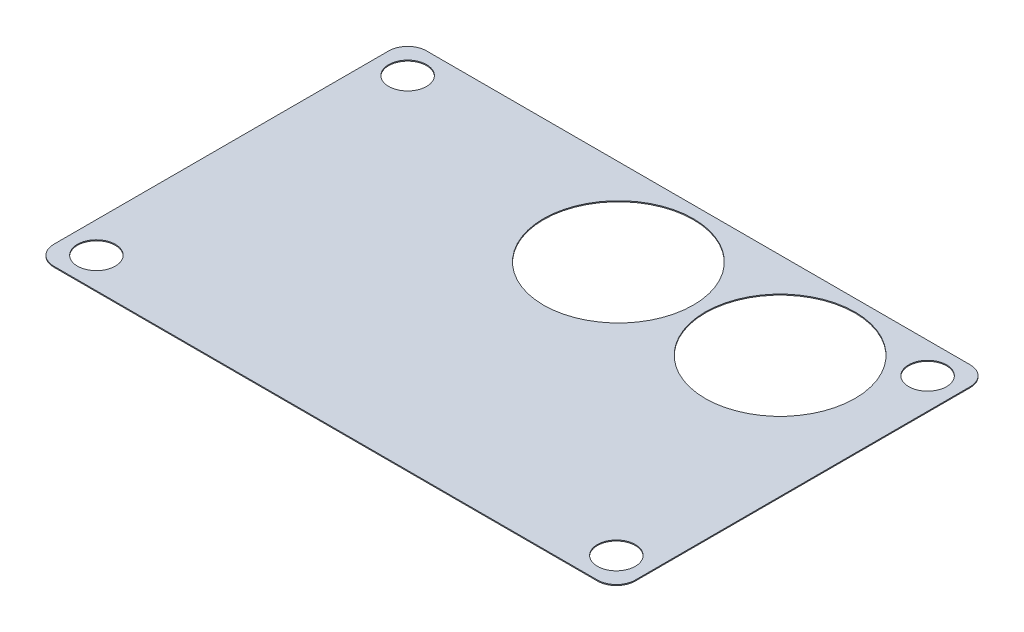
ISO-10303-21;
HEADER;
FILE_DESCRIPTION(('STEP AP214'),'2;1');
FILE_NAME('part.step','',(''),(''),'','','');
FILE_SCHEMA(('AUTOMOTIVE_DESIGN { 1 0 10303 214 1 1 1 1 }'));
ENDSEC;
DATA;
#1=APPLICATION_CONTEXT('core data for automotive mechanical design processes');
#2=APPLICATION_PROTOCOL_DEFINITION('international standard','automotive_design',2000,#1);
#3=PRODUCT_CONTEXT('',#1,'mechanical');
#4=PRODUCT('Part','Part','',(#3));
#5=PRODUCT_RELATED_PRODUCT_CATEGORY('part','',(#4));
#6=PRODUCT_DEFINITION_FORMATION('','',#4);
#7=PRODUCT_DEFINITION_CONTEXT('part definition',#1,'design');
#8=PRODUCT_DEFINITION('design','',#6,#7);
#9=PRODUCT_DEFINITION_SHAPE('','',#8);
#10=(LENGTH_UNIT() NAMED_UNIT(*) SI_UNIT(.MILLI.,.METRE.));
#11=(NAMED_UNIT(*) PLANE_ANGLE_UNIT() SI_UNIT($,.RADIAN.));
#12=(NAMED_UNIT(*) SI_UNIT($,.STERADIAN.) SOLID_ANGLE_UNIT());
#13=UNCERTAINTY_MEASURE_WITH_UNIT(LENGTH_MEASURE(1.E-05),#10,'distance_accuracy_value','');
#14=(GEOMETRIC_REPRESENTATION_CONTEXT(3) GLOBAL_UNCERTAINTY_ASSIGNED_CONTEXT((#13)) GLOBAL_UNIT_ASSIGNED_CONTEXT((#10,
#11,#12)) REPRESENTATION_CONTEXT('',''));
#15=CARTESIAN_POINT('',(0.,0.,0.));
#16=DIRECTION('',(0.,0.,1.));
#17=DIRECTION('',(1.,0.,0.));
#18=AXIS2_PLACEMENT_3D('',#15,#16,#17);
#19=CARTESIAN_POINT('',(0.,0.127,0.));
#20=DIRECTION('',(1.,0.,0.));
#21=DIRECTION('',(0.,0.,-1.));
#22=AXIS2_PLACEMENT_3D('',#19,#20,#21);
#23=PLANE('',#22);
#24=DIRECTION('',(0.,0.,1.));
#25=VECTOR('',#24,1.);
#26=CARTESIAN_POINT('',(0.,0.127,0.));
#27=LINE('',#26,#25);
#28=CARTESIAN_POINT('',(0.,0.127,-47.46));
#29=VERTEX_POINT('',#28);
#30=CARTESIAN_POINT('',(0.,0.127,-2.54));
#31=VERTEX_POINT('',#30);
#32=EDGE_CURVE('E128',#29,#31,#27,.T.);
#33=ORIENTED_EDGE('',*,*,#32,.F.);
#34=DIRECTION('',(0.,-1.,0.));
#35=VECTOR('',#34,1.);
#36=CARTESIAN_POINT('',(0.,0.127,-47.46));
#37=LINE('',#36,#35);
#38=CARTESIAN_POINT('',(0.,0.,-47.46));
#39=VERTEX_POINT('',#38);
#40=EDGE_CURVE('E11',#29,#39,#37,.T.);
#41=ORIENTED_EDGE('',*,*,#40,.T.);
#42=DIRECTION('',(0.,0.,1.));
#43=VECTOR('',#42,1.);
#44=CARTESIAN_POINT('',(0.,0.,0.));
#45=LINE('',#44,#43);
#46=CARTESIAN_POINT('',(0.,0.,-2.54));
#47=VERTEX_POINT('',#46);
#48=EDGE_CURVE('E130',#39,#47,#45,.T.);
#49=ORIENTED_EDGE('',*,*,#48,.T.);
#50=DIRECTION('',(0.,-1.,0.));
#51=VECTOR('',#50,1.);
#52=CARTESIAN_POINT('',(0.,0.127,-2.54));
#53=LINE('',#52,#51);
#54=EDGE_CURVE('E41',#47,#31,#53,.F.);
#55=ORIENTED_EDGE('',*,*,#54,.T.);
#56=EDGE_LOOP('',(#33,#41,#49,#55));
#57=FACE_BOUND('',#56,.T.);
#58=ADVANCED_FACE('F33',(#57),#23,.F.);
#59=CARTESIAN_POINT('',(0.,0.127,0.));
#60=DIRECTION('',(0.,0.,-1.));
#61=DIRECTION('',(-1.,0.,0.));
#62=AXIS2_PLACEMENT_3D('',#59,#60,#61);
#63=PLANE('',#62);
#64=DIRECTION('',(1.,0.,0.));
#65=VECTOR('',#64,1.);
#66=CARTESIAN_POINT('',(0.,0.,0.));
#67=LINE('',#66,#65);
#68=CARTESIAN_POINT('',(2.54,0.,0.));
#69=VERTEX_POINT('',#68);
#70=CARTESIAN_POINT('',(75.46,0.,0.));
#71=VERTEX_POINT('',#70);
#72=EDGE_CURVE('E126',#69,#71,#67,.T.);
#73=ORIENTED_EDGE('',*,*,#72,.T.);
#74=DIRECTION('',(0.,-1.,0.));
#75=VECTOR('',#74,1.);
#76=CARTESIAN_POINT('',(75.46,0.127,0.));
#77=LINE('',#76,#75);
#78=CARTESIAN_POINT('',(75.46,0.127,0.));
#79=VERTEX_POINT('',#78);
#80=EDGE_CURVE('E105',#71,#79,#77,.F.);
#81=ORIENTED_EDGE('',*,*,#80,.T.);
#82=DIRECTION('',(1.,0.,0.));
#83=VECTOR('',#82,1.);
#84=CARTESIAN_POINT('',(0.,0.127,0.));
#85=LINE('',#84,#83);
#86=CARTESIAN_POINT('',(2.54,0.127,0.));
#87=VERTEX_POINT('',#86);
#88=EDGE_CURVE('E166',#87,#79,#85,.T.);
#89=ORIENTED_EDGE('',*,*,#88,.F.);
#90=DIRECTION('',(0.,-1.,0.));
#91=VECTOR('',#90,1.);
#92=CARTESIAN_POINT('',(2.54,0.127,0.));
#93=LINE('',#92,#91);
#94=EDGE_CURVE('E110',#87,#69,#93,.T.);
#95=ORIENTED_EDGE('',*,*,#94,.T.);
#96=EDGE_LOOP('',(#73,#81,#89,#95));
#97=FACE_BOUND('',#96,.T.);
#98=ADVANCED_FACE('F170',(#97),#63,.F.);
#99=CARTESIAN_POINT('',(78.,0.127,0.));
#100=DIRECTION('',(-1.,0.,0.));
#101=DIRECTION('',(0.,0.,1.));
#102=AXIS2_PLACEMENT_3D('',#99,#100,#101);
#103=PLANE('',#102);
#104=DIRECTION('',(0.,0.,-1.));
#105=VECTOR('',#104,1.);
#106=CARTESIAN_POINT('',(78.,0.127,0.));
#107=LINE('',#106,#105);
#108=CARTESIAN_POINT('',(78.,0.127,-2.54));
#109=VERTEX_POINT('',#108);
#110=CARTESIAN_POINT('',(78.,0.127,-47.46));
#111=VERTEX_POINT('',#110);
#112=EDGE_CURVE('E119',#109,#111,#107,.T.);
#113=ORIENTED_EDGE('',*,*,#112,.F.);
#114=DIRECTION('',(0.,-1.,0.));
#115=VECTOR('',#114,1.);
#116=CARTESIAN_POINT('',(78.,0.127,-2.54));
#117=LINE('',#116,#115);
#118=CARTESIAN_POINT('',(78.,0.,-2.54));
#119=VERTEX_POINT('',#118);
#120=EDGE_CURVE('E104',#109,#119,#117,.T.);
#121=ORIENTED_EDGE('',*,*,#120,.T.);
#122=DIRECTION('',(0.,0.,-1.));
#123=VECTOR('',#122,1.);
#124=CARTESIAN_POINT('',(78.,0.,0.));
#125=LINE('',#124,#123);
#126=CARTESIAN_POINT('',(78.,0.,-47.46));
#127=VERTEX_POINT('',#126);
#128=EDGE_CURVE('E117',#119,#127,#125,.T.);
#129=ORIENTED_EDGE('',*,*,#128,.T.);
#130=DIRECTION('',(0.,-1.,0.));
#131=VECTOR('',#130,1.);
#132=CARTESIAN_POINT('',(78.,0.127,-47.46));
#133=LINE('',#132,#131);
#134=EDGE_CURVE('E121',#127,#111,#133,.F.);
#135=ORIENTED_EDGE('',*,*,#134,.T.);
#136=EDGE_LOOP('',(#113,#121,#129,#135));
#137=FACE_BOUND('',#136,.T.);
#138=ADVANCED_FACE('F116',(#137),#103,.F.);
#139=CARTESIAN_POINT('',(0.,0.127,-50.));
#140=DIRECTION('',(0.,0.,1.));
#141=DIRECTION('',(1.,0.,0.));
#142=AXIS2_PLACEMENT_3D('',#139,#140,#141);
#143=PLANE('',#142);
#144=DIRECTION('',(-1.,0.,0.));
#145=VECTOR('',#144,1.);
#146=CARTESIAN_POINT('',(0.,0.127,-50.));
#147=LINE('',#146,#145);
#148=CARTESIAN_POINT('',(75.46,0.127,-50.));
#149=VERTEX_POINT('',#148);
#150=CARTESIAN_POINT('',(2.54,0.127,-50.));
#151=VERTEX_POINT('',#150);
#152=EDGE_CURVE('E134',#149,#151,#147,.T.);
#153=ORIENTED_EDGE('',*,*,#152,.F.);
#154=DIRECTION('',(0.,-1.,0.));
#155=VECTOR('',#154,1.);
#156=CARTESIAN_POINT('',(75.46,0.127,-50.));
#157=LINE('',#156,#155);
#158=CARTESIAN_POINT('',(75.46,0.,-50.));
#159=VERTEX_POINT('',#158);
#160=EDGE_CURVE('E151',#149,#159,#157,.T.);
#161=ORIENTED_EDGE('',*,*,#160,.T.);
#162=DIRECTION('',(-1.,0.,0.));
#163=VECTOR('',#162,1.);
#164=CARTESIAN_POINT('',(0.,0.,-50.));
#165=LINE('',#164,#163);
#166=CARTESIAN_POINT('',(2.54,0.,-50.));
#167=VERTEX_POINT('',#166);
#168=EDGE_CURVE('E125',#159,#167,#165,.T.);
#169=ORIENTED_EDGE('',*,*,#168,.T.);
#170=DIRECTION('',(0.,-1.,0.));
#171=VECTOR('',#170,1.);
#172=CARTESIAN_POINT('',(2.54,0.127,-50.));
#173=LINE('',#172,#171);
#174=EDGE_CURVE('E48',#167,#151,#173,.F.);
#175=ORIENTED_EDGE('',*,*,#174,.T.);
#176=EDGE_LOOP('',(#153,#161,#169,#175));
#177=FACE_BOUND('',#176,.T.);
#178=ADVANCED_FACE('F223',(#177),#143,.F.);
#179=CARTESIAN_POINT('',(0.,0.127,0.));
#180=DIRECTION('',(0.,-1.,0.));
#181=DIRECTION('',(0.,0.,-1.));
#182=AXIS2_PLACEMENT_3D('',#179,#180,#181);
#183=PLANE('',#182);
#184=CARTESIAN_POINT('',(39.9125,0.127,-38.3625));
#185=DIRECTION('',(0.,1.,0.));
#186=DIRECTION('',(0.,0.,1.));
#187=AXIS2_PLACEMENT_3D('',#184,#185,#186);
#188=CIRCLE('',#187,10.05);
#189=CARTESIAN_POINT('',(39.9125,0.127,-28.3125));
#190=VERTEX_POINT('',#189);
#191=EDGE_CURVE('E206',#190,#190,#188,.T.);
#192=ORIENTED_EDGE('',*,*,#191,.F.);
#193=EDGE_LOOP('',(#192));
#194=FACE_BOUND('',#193,.T.);
#195=CARTESIAN_POINT('',(61.6,0.127,-38.3625));
#196=DIRECTION('',(0.,1.,0.));
#197=DIRECTION('',(0.,0.,1.));
#198=AXIS2_PLACEMENT_3D('',#195,#196,#197);
#199=CIRCLE('',#198,10.05);
#200=CARTESIAN_POINT('',(61.6,0.127,-28.3125));
#201=VERTEX_POINT('',#200);
#202=EDGE_CURVE('E200',#201,#201,#199,.T.);
#203=ORIENTED_EDGE('',*,*,#202,.F.);
#204=EDGE_LOOP('',(#203));
#205=FACE_BOUND('',#204,.T.);
#206=CARTESIAN_POINT('',(73.8725,0.127,-4.1275));
#207=DIRECTION('',(0.,-1.,0.));
#208=DIRECTION('',(0.,0.,1.));
#209=AXIS2_PLACEMENT_3D('',#206,#207,#208);
#210=CIRCLE('',#209,2.54);
#211=CARTESIAN_POINT('',(73.8725,0.127,-1.5875));
#212=VERTEX_POINT('',#211);
#213=EDGE_CURVE('E194',#212,#212,#210,.T.);
#214=ORIENTED_EDGE('',*,*,#213,.T.);
#215=EDGE_LOOP('',(#214));
#216=FACE_BOUND('',#215,.T.);
#217=CARTESIAN_POINT('',(73.8725,0.127,-45.8725));
#218=DIRECTION('',(0.,1.,0.));
#219=DIRECTION('',(0.,0.,-1.));
#220=AXIS2_PLACEMENT_3D('',#217,#218,#219);
#221=CIRCLE('',#220,2.54);
#222=CARTESIAN_POINT('',(73.8725,0.127,-48.4125));
#223=VERTEX_POINT('',#222);
#224=EDGE_CURVE('E188',#223,#223,#221,.T.);
#225=ORIENTED_EDGE('',*,*,#224,.F.);
#226=EDGE_LOOP('',(#225));
#227=FACE_BOUND('',#226,.T.);
#228=CARTESIAN_POINT('',(4.1275,0.127,-45.8725));
#229=DIRECTION('',(0.,-1.,0.));
#230=DIRECTION('',(0.,0.,-1.));
#231=AXIS2_PLACEMENT_3D('',#228,#229,#230);
#232=CIRCLE('',#231,2.54);
#233=CARTESIAN_POINT('',(4.1275,0.127,-48.4125));
#234=VERTEX_POINT('',#233);
#235=EDGE_CURVE('E182',#234,#234,#232,.T.);
#236=ORIENTED_EDGE('',*,*,#235,.T.);
#237=EDGE_LOOP('',(#236));
#238=FACE_BOUND('',#237,.T.);
#239=CARTESIAN_POINT('',(4.1275,0.127,-4.1275));
#240=DIRECTION('',(0.,1.,0.));
#241=DIRECTION('',(0.,0.,1.));
#242=AXIS2_PLACEMENT_3D('',#239,#240,#241);
#243=CIRCLE('',#242,2.54);
#244=CARTESIAN_POINT('',(4.1275,0.127,-1.5875));
#245=VERTEX_POINT('',#244);
#246=EDGE_CURVE('E173',#245,#245,#243,.T.);
#247=ORIENTED_EDGE('',*,*,#246,.F.);
#248=EDGE_LOOP('',(#247));
#249=FACE_BOUND('',#248,.T.);
#250=ORIENTED_EDGE('',*,*,#88,.T.);
#251=CARTESIAN_POINT('',(75.46,0.127,-2.54));
#252=DIRECTION('',(0.,-1.,0.));
#253=DIRECTION('',(0.,0.,-1.));
#254=AXIS2_PLACEMENT_3D('',#251,#252,#253);
#255=CIRCLE('',#254,2.54);
#256=EDGE_CURVE('E148',#79,#109,#255,.F.);
#257=ORIENTED_EDGE('',*,*,#256,.T.);
#258=ORIENTED_EDGE('',*,*,#112,.T.);
#259=CARTESIAN_POINT('',(75.46,0.127,-47.46));
#260=DIRECTION('',(0.,-1.,0.));
#261=DIRECTION('',(0.,0.,-1.));
#262=AXIS2_PLACEMENT_3D('',#259,#260,#261);
#263=CIRCLE('',#262,2.54);
#264=EDGE_CURVE('E55',#111,#149,#263,.F.);
#265=ORIENTED_EDGE('',*,*,#264,.T.);
#266=ORIENTED_EDGE('',*,*,#152,.T.);
#267=CARTESIAN_POINT('',(2.54,0.127,-47.46));
#268=DIRECTION('',(0.,-1.,0.));
#269=DIRECTION('',(0.,0.,-1.));
#270=AXIS2_PLACEMENT_3D('',#267,#268,#269);
#271=CIRCLE('',#270,2.54);
#272=EDGE_CURVE('E145',#151,#29,#271,.F.);
#273=ORIENTED_EDGE('',*,*,#272,.T.);
#274=ORIENTED_EDGE('',*,*,#32,.T.);
#275=CARTESIAN_POINT('',(2.54,0.127,-2.54));
#276=DIRECTION('',(0.,-1.,0.));
#277=DIRECTION('',(0.,0.,-1.));
#278=AXIS2_PLACEMENT_3D('',#275,#276,#277);
#279=CIRCLE('',#278,2.54);
#280=EDGE_CURVE('E143',#31,#87,#279,.F.);
#281=ORIENTED_EDGE('',*,*,#280,.T.);
#282=EDGE_LOOP('',(#250,#257,#258,#265,#266,#273,#274,#281));
#283=FACE_BOUND('',#282,.T.);
#284=ADVANCED_FACE('F163',(#194,#205,#216,#227,#238,#249,#283),#183,.F.);
#285=CARTESIAN_POINT('',(0.,0.,0.));
#286=DIRECTION('',(0.,-1.,0.));
#287=DIRECTION('',(0.,0.,-1.));
#288=AXIS2_PLACEMENT_3D('',#285,#286,#287);
#289=PLANE('',#288);
#290=CARTESIAN_POINT('',(39.9125,0.,-38.3625));
#291=DIRECTION('',(0.,1.,0.));
#292=DIRECTION('',(0.,0.,1.));
#293=AXIS2_PLACEMENT_3D('',#290,#291,#292);
#294=CIRCLE('',#293,10.05);
#295=CARTESIAN_POINT('',(39.9125,0.,-28.3125));
#296=VERTEX_POINT('',#295);
#297=EDGE_CURVE('E203',#296,#296,#294,.T.);
#298=ORIENTED_EDGE('',*,*,#297,.T.);
#299=EDGE_LOOP('',(#298));
#300=FACE_BOUND('',#299,.T.);
#301=CARTESIAN_POINT('',(61.6,0.,-38.3625));
#302=DIRECTION('',(0.,1.,0.));
#303=DIRECTION('',(0.,0.,1.));
#304=AXIS2_PLACEMENT_3D('',#301,#302,#303);
#305=CIRCLE('',#304,10.05);
#306=CARTESIAN_POINT('',(61.6,0.,-28.3125));
#307=VERTEX_POINT('',#306);
#308=EDGE_CURVE('E197',#307,#307,#305,.T.);
#309=ORIENTED_EDGE('',*,*,#308,.T.);
#310=EDGE_LOOP('',(#309));
#311=FACE_BOUND('',#310,.T.);
#312=CARTESIAN_POINT('',(73.8725,0.,-4.1275));
#313=DIRECTION('',(0.,-1.,0.));
#314=DIRECTION('',(0.,0.,1.));
#315=AXIS2_PLACEMENT_3D('',#312,#313,#314);
#316=CIRCLE('',#315,2.54);
#317=CARTESIAN_POINT('',(73.8725,0.,-1.5875));
#318=VERTEX_POINT('',#317);
#319=EDGE_CURVE('E191',#318,#318,#316,.T.);
#320=ORIENTED_EDGE('',*,*,#319,.F.);
#321=EDGE_LOOP('',(#320));
#322=FACE_BOUND('',#321,.T.);
#323=CARTESIAN_POINT('',(73.8725,0.,-45.8725));
#324=DIRECTION('',(0.,1.,0.));
#325=DIRECTION('',(0.,0.,-1.));
#326=AXIS2_PLACEMENT_3D('',#323,#324,#325);
#327=CIRCLE('',#326,2.54);
#328=CARTESIAN_POINT('',(73.8725,0.,-48.4125));
#329=VERTEX_POINT('',#328);
#330=EDGE_CURVE('E185',#329,#329,#327,.T.);
#331=ORIENTED_EDGE('',*,*,#330,.T.);
#332=EDGE_LOOP('',(#331));
#333=FACE_BOUND('',#332,.T.);
#334=CARTESIAN_POINT('',(4.1275,0.,-45.8725));
#335=DIRECTION('',(0.,-1.,0.));
#336=DIRECTION('',(0.,0.,-1.));
#337=AXIS2_PLACEMENT_3D('',#334,#335,#336);
#338=CIRCLE('',#337,2.54);
#339=CARTESIAN_POINT('',(4.1275,0.,-48.4125));
#340=VERTEX_POINT('',#339);
#341=EDGE_CURVE('E180',#340,#340,#338,.T.);
#342=ORIENTED_EDGE('',*,*,#341,.F.);
#343=EDGE_LOOP('',(#342));
#344=FACE_BOUND('',#343,.T.);
#345=CARTESIAN_POINT('',(4.1275,0.,-4.1275));
#346=DIRECTION('',(0.,1.,0.));
#347=DIRECTION('',(0.,0.,1.));
#348=AXIS2_PLACEMENT_3D('',#345,#346,#347);
#349=CIRCLE('',#348,2.54);
#350=CARTESIAN_POINT('',(4.1275,0.,-1.5875));
#351=VERTEX_POINT('',#350);
#352=EDGE_CURVE('E171',#351,#351,#349,.T.);
#353=ORIENTED_EDGE('',*,*,#352,.T.);
#354=EDGE_LOOP('',(#353));
#355=FACE_BOUND('',#354,.T.);
#356=ORIENTED_EDGE('',*,*,#128,.F.);
#357=CARTESIAN_POINT('',(75.46,0.,-2.54));
#358=DIRECTION('',(0.,-1.,0.));
#359=DIRECTION('',(0.,0.,-1.));
#360=AXIS2_PLACEMENT_3D('',#357,#358,#359);
#361=CIRCLE('',#360,2.54);
#362=EDGE_CURVE('E100',#119,#71,#361,.T.);
#363=ORIENTED_EDGE('',*,*,#362,.T.);
#364=ORIENTED_EDGE('',*,*,#72,.F.);
#365=CARTESIAN_POINT('',(2.54,0.,-2.54));
#366=DIRECTION('',(0.,-1.,0.));
#367=DIRECTION('',(0.,0.,-1.));
#368=AXIS2_PLACEMENT_3D('',#365,#366,#367);
#369=CIRCLE('',#368,2.54);
#370=EDGE_CURVE('E120',#69,#47,#369,.T.);
#371=ORIENTED_EDGE('',*,*,#370,.T.);
#372=ORIENTED_EDGE('',*,*,#48,.F.);
#373=CARTESIAN_POINT('',(2.54,0.,-47.46));
#374=DIRECTION('',(0.,-1.,0.));
#375=DIRECTION('',(0.,0.,-1.));
#376=AXIS2_PLACEMENT_3D('',#373,#374,#375);
#377=CIRCLE('',#376,2.54);
#378=EDGE_CURVE('E137',#39,#167,#377,.T.);
#379=ORIENTED_EDGE('',*,*,#378,.T.);
#380=ORIENTED_EDGE('',*,*,#168,.F.);
#381=CARTESIAN_POINT('',(75.46,0.,-47.46));
#382=DIRECTION('',(0.,-1.,0.));
#383=DIRECTION('',(0.,0.,-1.));
#384=AXIS2_PLACEMENT_3D('',#381,#382,#383);
#385=CIRCLE('',#384,2.54);
#386=EDGE_CURVE('E111',#159,#127,#385,.T.);
#387=ORIENTED_EDGE('',*,*,#386,.T.);
#388=EDGE_LOOP('',(#356,#363,#364,#371,#372,#379,#380,#387));
#389=FACE_BOUND('',#388,.T.);
#390=ADVANCED_FACE('F123',(#300,#311,#322,#333,#344,#355,#389),#289,.T.);
#391=CARTESIAN_POINT('',(75.46,0.127,-2.54));
#392=DIRECTION('',(0.,-1.,0.));
#393=DIRECTION('',(0.,0.,-1.));
#394=AXIS2_PLACEMENT_3D('',#391,#392,#393);
#395=CYLINDRICAL_SURFACE('',#394,2.54);
#396=ORIENTED_EDGE('',*,*,#256,.F.);
#397=ORIENTED_EDGE('',*,*,#80,.F.);
#398=ORIENTED_EDGE('',*,*,#362,.F.);
#399=ORIENTED_EDGE('',*,*,#120,.F.);
#400=EDGE_LOOP('',(#396,#397,#398,#399));
#401=FACE_BOUND('',#400,.T.);
#402=ADVANCED_FACE('F103',(#401),#395,.T.);
#403=CARTESIAN_POINT('',(75.46,0.127,-47.46));
#404=DIRECTION('',(0.,-1.,0.));
#405=DIRECTION('',(0.,0.,-1.));
#406=AXIS2_PLACEMENT_3D('',#403,#404,#405);
#407=CYLINDRICAL_SURFACE('',#406,2.54);
#408=ORIENTED_EDGE('',*,*,#264,.F.);
#409=ORIENTED_EDGE('',*,*,#134,.F.);
#410=ORIENTED_EDGE('',*,*,#386,.F.);
#411=ORIENTED_EDGE('',*,*,#160,.F.);
#412=EDGE_LOOP('',(#408,#409,#410,#411));
#413=FACE_BOUND('',#412,.T.);
#414=ADVANCED_FACE('F259',(#413),#407,.T.);
#415=CARTESIAN_POINT('',(2.54,0.127,-47.46));
#416=DIRECTION('',(0.,-1.,0.));
#417=DIRECTION('',(0.,0.,-1.));
#418=AXIS2_PLACEMENT_3D('',#415,#416,#417);
#419=CYLINDRICAL_SURFACE('',#418,2.54);
#420=ORIENTED_EDGE('',*,*,#272,.F.);
#421=ORIENTED_EDGE('',*,*,#174,.F.);
#422=ORIENTED_EDGE('',*,*,#378,.F.);
#423=ORIENTED_EDGE('',*,*,#40,.F.);
#424=EDGE_LOOP('',(#420,#421,#422,#423));
#425=FACE_BOUND('',#424,.T.);
#426=ADVANCED_FACE('F247',(#425),#419,.T.);
#427=CARTESIAN_POINT('',(2.54,0.127,-2.54));
#428=DIRECTION('',(0.,-1.,0.));
#429=DIRECTION('',(0.,0.,-1.));
#430=AXIS2_PLACEMENT_3D('',#427,#428,#429);
#431=CYLINDRICAL_SURFACE('',#430,2.54);
#432=ORIENTED_EDGE('',*,*,#280,.F.);
#433=ORIENTED_EDGE('',*,*,#54,.F.);
#434=ORIENTED_EDGE('',*,*,#370,.F.);
#435=ORIENTED_EDGE('',*,*,#94,.F.);
#436=EDGE_LOOP('',(#432,#433,#434,#435));
#437=FACE_BOUND('',#436,.T.);
#438=ADVANCED_FACE('F35',(#437),#431,.T.);
#439=CARTESIAN_POINT('',(4.1275,0.,-4.1275));
#440=DIRECTION('',(0.,1.,0.));
#441=DIRECTION('',(0.,0.,1.));
#442=AXIS2_PLACEMENT_3D('',#439,#440,#441);
#443=CYLINDRICAL_SURFACE('',#442,2.54);
#444=ORIENTED_EDGE('',*,*,#352,.F.);
#445=EDGE_LOOP('',(#444));
#446=FACE_BOUND('',#445,.T.);
#447=ORIENTED_EDGE('',*,*,#246,.T.);
#448=EDGE_LOOP('',(#447));
#449=FACE_BOUND('',#448,.T.);
#450=ADVANCED_FACE('F235',(#446,#449),#443,.F.);
#451=CARTESIAN_POINT('',(4.1275,0.,-45.8725));
#452=DIRECTION('',(0.,1.,0.));
#453=DIRECTION('',(0.,0.,1.));
#454=AXIS2_PLACEMENT_3D('',#451,#452,#453);
#455=CYLINDRICAL_SURFACE('',#454,2.54);
#456=ORIENTED_EDGE('',*,*,#341,.T.);
#457=EDGE_LOOP('',(#456));
#458=FACE_BOUND('',#457,.T.);
#459=ORIENTED_EDGE('',*,*,#235,.F.);
#460=EDGE_LOOP('',(#459));
#461=FACE_BOUND('',#460,.T.);
#462=ADVANCED_FACE('F237',(#458,#461),#455,.F.);
#463=CARTESIAN_POINT('',(73.8725,0.,-45.8725));
#464=DIRECTION('',(0.,1.,0.));
#465=DIRECTION('',(0.,0.,1.));
#466=AXIS2_PLACEMENT_3D('',#463,#464,#465);
#467=CYLINDRICAL_SURFACE('',#466,2.54);
#468=ORIENTED_EDGE('',*,*,#330,.F.);
#469=EDGE_LOOP('',(#468));
#470=FACE_BOUND('',#469,.T.);
#471=ORIENTED_EDGE('',*,*,#224,.T.);
#472=EDGE_LOOP('',(#471));
#473=FACE_BOUND('',#472,.T.);
#474=ADVANCED_FACE('F244',(#470,#473),#467,.F.);
#475=CARTESIAN_POINT('',(73.8725,0.,-4.1275));
#476=DIRECTION('',(0.,1.,0.));
#477=DIRECTION('',(0.,0.,1.));
#478=AXIS2_PLACEMENT_3D('',#475,#476,#477);
#479=CYLINDRICAL_SURFACE('',#478,2.54);
#480=ORIENTED_EDGE('',*,*,#319,.T.);
#481=EDGE_LOOP('',(#480));
#482=FACE_BOUND('',#481,.T.);
#483=ORIENTED_EDGE('',*,*,#213,.F.);
#484=EDGE_LOOP('',(#483));
#485=FACE_BOUND('',#484,.T.);
#486=ADVANCED_FACE('F291',(#482,#485),#479,.F.);
#487=CARTESIAN_POINT('',(61.6,0.,-38.3625));
#488=DIRECTION('',(0.,1.,0.));
#489=DIRECTION('',(0.,0.,1.));
#490=AXIS2_PLACEMENT_3D('',#487,#488,#489);
#491=CYLINDRICAL_SURFACE('',#490,10.05);
#492=ORIENTED_EDGE('',*,*,#308,.F.);
#493=EDGE_LOOP('',(#492));
#494=FACE_BOUND('',#493,.T.);
#495=ORIENTED_EDGE('',*,*,#202,.T.);
#496=EDGE_LOOP('',(#495));
#497=FACE_BOUND('',#496,.T.);
#498=ADVANCED_FACE('F217',(#494,#497),#491,.F.);
#499=CARTESIAN_POINT('',(39.9125,0.,-38.3625));
#500=DIRECTION('',(0.,1.,0.));
#501=DIRECTION('',(0.,0.,1.));
#502=AXIS2_PLACEMENT_3D('',#499,#500,#501);
#503=CYLINDRICAL_SURFACE('',#502,10.05);
#504=ORIENTED_EDGE('',*,*,#297,.F.);
#505=EDGE_LOOP('',(#504));
#506=FACE_BOUND('',#505,.T.);
#507=ORIENTED_EDGE('',*,*,#191,.T.);
#508=EDGE_LOOP('',(#507));
#509=FACE_BOUND('',#508,.T.);
#510=ADVANCED_FACE('F214',(#506,#509),#503,.F.);
#511=CLOSED_SHELL('',(#58,#98,#138,#178,#284,#390,#402,#414,#426,#438,#450,#462,#474,#486,#498,#510));
#512=MANIFOLD_SOLID_BREP('B2',#511);
#513=ADVANCED_BREP_SHAPE_REPRESENTATION('',(#18,#512),#14);
#514=SHAPE_DEFINITION_REPRESENTATION(#9,#513);
ENDSEC;
END-ISO-10303-21;
